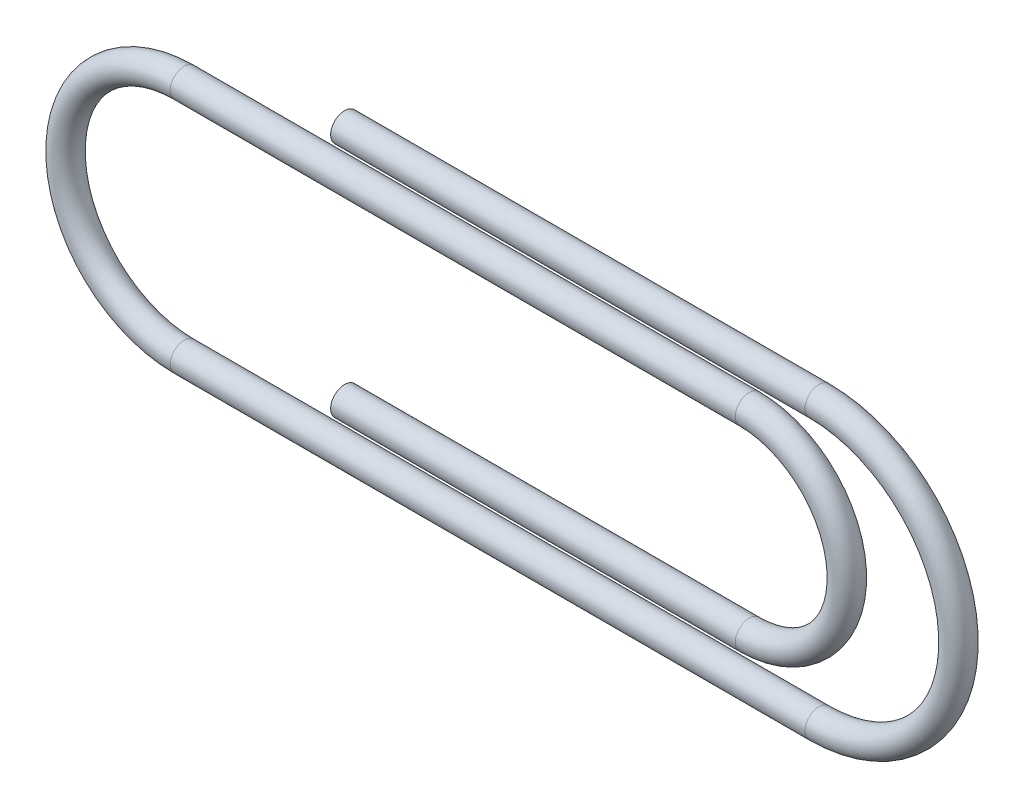
ISO-10303-21;
HEADER;
FILE_DESCRIPTION(('STEP AP214'),'2;1');
FILE_NAME('part.step','',(''),(''),'','','');
FILE_SCHEMA(('AUTOMOTIVE_DESIGN { 1 0 10303 214 1 1 1 1 }'));
ENDSEC;
DATA;
#1=APPLICATION_CONTEXT('core data for automotive mechanical design processes');
#2=APPLICATION_PROTOCOL_DEFINITION('international standard','automotive_design',2000,#1);
#3=PRODUCT_CONTEXT('',#1,'mechanical');
#4=PRODUCT('Part','Part','',(#3));
#5=PRODUCT_RELATED_PRODUCT_CATEGORY('part','',(#4));
#6=PRODUCT_DEFINITION_FORMATION('','',#4);
#7=PRODUCT_DEFINITION_CONTEXT('part definition',#1,'design');
#8=PRODUCT_DEFINITION('design','',#6,#7);
#9=PRODUCT_DEFINITION_SHAPE('','',#8);
#10=(LENGTH_UNIT() NAMED_UNIT(*) SI_UNIT(.MILLI.,.METRE.));
#11=(NAMED_UNIT(*) PLANE_ANGLE_UNIT() SI_UNIT($,.RADIAN.));
#12=(NAMED_UNIT(*) SI_UNIT($,.STERADIAN.) SOLID_ANGLE_UNIT());
#13=UNCERTAINTY_MEASURE_WITH_UNIT(LENGTH_MEASURE(1.E-05),#10,'distance_accuracy_value','');
#14=(GEOMETRIC_REPRESENTATION_CONTEXT(3) GLOBAL_UNCERTAINTY_ASSIGNED_CONTEXT((#13)) GLOBAL_UNIT_ASSIGNED_CONTEXT((#10,
#11,#12)) REPRESENTATION_CONTEXT('',''));
#15=CARTESIAN_POINT('',(0.,0.,0.));
#16=DIRECTION('',(0.,0.,1.));
#17=DIRECTION('',(1.,0.,0.));
#18=AXIS2_PLACEMENT_3D('',#15,#16,#17);
#19=CARTESIAN_POINT('',(0.,0.,0.));
#20=DIRECTION('',(1.,0.,0.));
#21=DIRECTION('',(0.,0.,-1.));
#22=AXIS2_PLACEMENT_3D('',#19,#20,#21);
#23=PLANE('',#22);
#24=CARTESIAN_POINT('',(0.,0.,0.));
#25=DIRECTION('',(1.,0.,0.));
#26=DIRECTION('',(0.,0.,-1.));
#27=AXIS2_PLACEMENT_3D('',#24,#25,#26);
#28=CIRCLE('',#27,0.5);
#29=CARTESIAN_POINT('',(0.,0.,-0.5));
#30=VERTEX_POINT('',#29);
#31=EDGE_CURVE('E63',#30,#30,#28,.T.);
#32=ORIENTED_EDGE('',*,*,#31,.F.);
#33=EDGE_LOOP('',(#32));
#34=FACE_BOUND('',#33,.T.);
#35=ADVANCED_FACE('F35',(#34),#23,.F.);
#36=CARTESIAN_POINT('',(0.,8.5,0.));
#37=DIRECTION('',(-1.,0.,0.));
#38=DIRECTION('',(0.,0.,-1.));
#39=AXIS2_PLACEMENT_3D('',#36,#37,#38);
#40=PLANE('',#39);
#41=CARTESIAN_POINT('',(0.,8.5,0.));
#42=DIRECTION('',(-1.,0.,0.));
#43=DIRECTION('',(0.,0.,-1.));
#44=AXIS2_PLACEMENT_3D('',#41,#42,#43);
#45=CIRCLE('',#44,0.5);
#46=CARTESIAN_POINT('',(0.,8.5,-0.5));
#47=VERTEX_POINT('',#46);
#48=EDGE_CURVE('E10',#47,#47,#45,.T.);
#49=ORIENTED_EDGE('',*,*,#48,.T.);
#50=EDGE_LOOP('',(#49));
#51=FACE_BOUND('',#50,.T.);
#52=ADVANCED_FACE('F70',(#51),#40,.T.);
#53=CARTESIAN_POINT('',(0.,0.,0.));
#54=DIRECTION('',(1.,0.,0.));
#55=DIRECTION('',(0.,1.,0.));
#56=AXIS2_PLACEMENT_3D('',#53,#54,#55);
#57=CYLINDRICAL_SURFACE('',#56,0.5);
#58=CARTESIAN_POINT('',(14.5,0.,0.));
#59=DIRECTION('',(1.,0.,0.));
#60=DIRECTION('',(0.,0.,-1.));
#61=AXIS2_PLACEMENT_3D('',#58,#59,#60);
#62=CIRCLE('',#61,0.5);
#63=CARTESIAN_POINT('',(14.5,-0.500000000000001,0.));
#64=VERTEX_POINT('',#63);
#65=EDGE_CURVE('E60',#64,#64,#62,.T.);
#66=ORIENTED_EDGE('',*,*,#65,.F.);
#67=EDGE_LOOP('',(#66));
#68=FACE_BOUND('',#67,.T.);
#69=ORIENTED_EDGE('',*,*,#31,.T.);
#70=EDGE_LOOP('',(#69));
#71=FACE_BOUND('',#70,.T.);
#72=ADVANCED_FACE('F67',(#68,#71),#57,.T.);
#73=CARTESIAN_POINT('',(14.5,3.5,0.));
#74=DIRECTION('',(0.,0.,1.));
#75=DIRECTION('',(1.,0.,0.));
#76=AXIS2_PLACEMENT_3D('',#73,#74,#75);
#77=TOROIDAL_SURFACE('',#76,3.5,0.5);
#78=CARTESIAN_POINT('',(14.5,6.99999999999999,0.));
#79=DIRECTION('',(-1.,0.,0.));
#80=DIRECTION('',(0.,0.,-1.));
#81=AXIS2_PLACEMENT_3D('',#78,#79,#80);
#82=CIRCLE('',#81,0.5);
#83=CARTESIAN_POINT('',(14.5,7.49999999999999,0.));
#84=VERTEX_POINT('',#83);
#85=EDGE_CURVE('E57',#84,#84,#82,.T.);
#86=CARTESIAN_POINT('',(14.5,3.5,0.));
#87=DIRECTION('',(0.,0.,1.));
#88=DIRECTION('',(1.,0.,0.));
#89=AXIS2_PLACEMENT_3D('',#86,#87,#88);
#90=CIRCLE('',#89,4.);
#91=EDGE_CURVE('',#64,#84,#90,.T.);
#92=ORIENTED_EDGE('',*,*,#65,.T.);
#93=ORIENTED_EDGE('',*,*,#85,.F.);
#94=ORIENTED_EDGE('',*,*,#91,.T.);
#95=ORIENTED_EDGE('',*,*,#91,.F.);
#96=EDGE_LOOP('',(#92,#94,#93,#95));
#97=FACE_BOUND('',#96,.T.);
#98=ADVANCED_FACE('F96',(#97),#77,.T.);
#99=CARTESIAN_POINT('',(14.5,6.99999999999999,0.));
#100=DIRECTION('',(-1.,0.,0.));
#101=DIRECTION('',(0.,-1.,0.));
#102=AXIS2_PLACEMENT_3D('',#99,#100,#101);
#103=CYLINDRICAL_SURFACE('',#102,0.5);
#104=CARTESIAN_POINT('',(-5.75000000000001,6.99999999999999,0.));
#105=DIRECTION('',(-1.,0.,0.));
#106=DIRECTION('',(0.,0.,-1.));
#107=AXIS2_PLACEMENT_3D('',#104,#105,#106);
#108=CIRCLE('',#107,0.5);
#109=CARTESIAN_POINT('',(-5.75000000000001,7.49999999999999,0.));
#110=VERTEX_POINT('',#109);
#111=EDGE_CURVE('E54',#110,#110,#108,.T.);
#112=ORIENTED_EDGE('',*,*,#111,.F.);
#113=EDGE_LOOP('',(#112));
#114=FACE_BOUND('',#113,.T.);
#115=ORIENTED_EDGE('',*,*,#85,.T.);
#116=EDGE_LOOP('',(#115));
#117=FACE_BOUND('',#116,.T.);
#118=ADVANCED_FACE('F92',(#114,#117),#103,.T.);
#119=CARTESIAN_POINT('',(-5.75000000000001,2.74999999999999,0.));
#120=DIRECTION('',(0.,0.,1.));
#121=DIRECTION('',(1.,0.,0.));
#122=AXIS2_PLACEMENT_3D('',#119,#120,#121);
#123=TOROIDAL_SURFACE('',#122,4.24999999999999,0.5);
#124=CARTESIAN_POINT('',(-5.75000000000001,-1.5,0.));
#125=DIRECTION('',(1.,0.,0.));
#126=DIRECTION('',(0.,0.,-1.));
#127=AXIS2_PLACEMENT_3D('',#124,#125,#126);
#128=CIRCLE('',#127,0.5);
#129=CARTESIAN_POINT('',(-5.75000000000001,-2.,0.));
#130=VERTEX_POINT('',#129);
#131=EDGE_CURVE('E49',#130,#130,#128,.T.);
#132=CARTESIAN_POINT('',(-5.75000000000001,2.74999999999999,0.));
#133=DIRECTION('',(0.,0.,1.));
#134=DIRECTION('',(1.,0.,0.));
#135=AXIS2_PLACEMENT_3D('',#132,#133,#134);
#136=CIRCLE('',#135,4.74999999999999);
#137=EDGE_CURVE('',#110,#130,#136,.T.);
#138=ORIENTED_EDGE('',*,*,#111,.T.);
#139=ORIENTED_EDGE('',*,*,#131,.F.);
#140=ORIENTED_EDGE('',*,*,#137,.T.);
#141=ORIENTED_EDGE('',*,*,#137,.F.);
#142=EDGE_LOOP('',(#138,#140,#139,#141));
#143=FACE_BOUND('',#142,.T.);
#144=ADVANCED_FACE('F88',(#143),#123,.T.);
#145=CARTESIAN_POINT('',(-5.75000000000001,-1.5,0.));
#146=DIRECTION('',(1.,0.,0.));
#147=DIRECTION('',(0.,1.,0.));
#148=AXIS2_PLACEMENT_3D('',#145,#146,#147);
#149=CYLINDRICAL_SURFACE('',#148,0.5);
#150=CARTESIAN_POINT('',(17.,-1.5,0.));
#151=DIRECTION('',(1.,0.,0.));
#152=DIRECTION('',(0.,0.,-1.));
#153=AXIS2_PLACEMENT_3D('',#150,#151,#152);
#154=CIRCLE('',#153,0.5);
#155=CARTESIAN_POINT('',(17.,-2.,0.));
#156=VERTEX_POINT('',#155);
#157=EDGE_CURVE('E45',#156,#156,#154,.T.);
#158=ORIENTED_EDGE('',*,*,#157,.F.);
#159=EDGE_LOOP('',(#158));
#160=FACE_BOUND('',#159,.T.);
#161=ORIENTED_EDGE('',*,*,#131,.T.);
#162=EDGE_LOOP('',(#161));
#163=FACE_BOUND('',#162,.T.);
#164=ADVANCED_FACE('F82',(#160,#163),#149,.T.);
#165=CARTESIAN_POINT('',(17.,3.5,0.));
#166=DIRECTION('',(0.,0.,1.));
#167=DIRECTION('',(1.,0.,0.));
#168=AXIS2_PLACEMENT_3D('',#165,#166,#167);
#169=TOROIDAL_SURFACE('',#168,5.,0.5);
#170=CARTESIAN_POINT('',(17.,8.5,0.));
#171=DIRECTION('',(-1.,0.,0.));
#172=DIRECTION('',(0.,0.,-1.));
#173=AXIS2_PLACEMENT_3D('',#170,#171,#172);
#174=CIRCLE('',#173,0.5);
#175=CARTESIAN_POINT('',(17.,9.,0.));
#176=VERTEX_POINT('',#175);
#177=EDGE_CURVE('E41',#176,#176,#174,.T.);
#178=CARTESIAN_POINT('',(17.,3.5,0.));
#179=DIRECTION('',(0.,0.,1.));
#180=DIRECTION('',(1.,0.,0.));
#181=AXIS2_PLACEMENT_3D('',#178,#179,#180);
#182=CIRCLE('',#181,5.5);
#183=EDGE_CURVE('',#156,#176,#182,.T.);
#184=ORIENTED_EDGE('',*,*,#157,.T.);
#185=ORIENTED_EDGE('',*,*,#177,.F.);
#186=ORIENTED_EDGE('',*,*,#183,.T.);
#187=ORIENTED_EDGE('',*,*,#183,.F.);
#188=EDGE_LOOP('',(#184,#186,#185,#187));
#189=FACE_BOUND('',#188,.T.);
#190=ADVANCED_FACE('F76',(#189),#169,.T.);
#191=CARTESIAN_POINT('',(17.,8.5,0.));
#192=DIRECTION('',(-1.,0.,0.));
#193=DIRECTION('',(0.,-1.,0.));
#194=AXIS2_PLACEMENT_3D('',#191,#192,#193);
#195=CYLINDRICAL_SURFACE('',#194,0.5);
#196=ORIENTED_EDGE('',*,*,#48,.F.);
#197=EDGE_LOOP('',(#196));
#198=FACE_BOUND('',#197,.T.);
#199=ORIENTED_EDGE('',*,*,#177,.T.);
#200=EDGE_LOOP('',(#199));
#201=FACE_BOUND('',#200,.T.);
#202=ADVANCED_FACE('F74',(#198,#201),#195,.T.);
#203=CLOSED_SHELL('',(#35,#52,#72,#98,#118,#144,#164,#190,#202));
#204=MANIFOLD_SOLID_BREP('B2',#203);
#205=ADVANCED_BREP_SHAPE_REPRESENTATION('',(#18,#204),#14);
#206=SHAPE_DEFINITION_REPRESENTATION(#9,#205);
ENDSEC;
END-ISO-10303-21;
